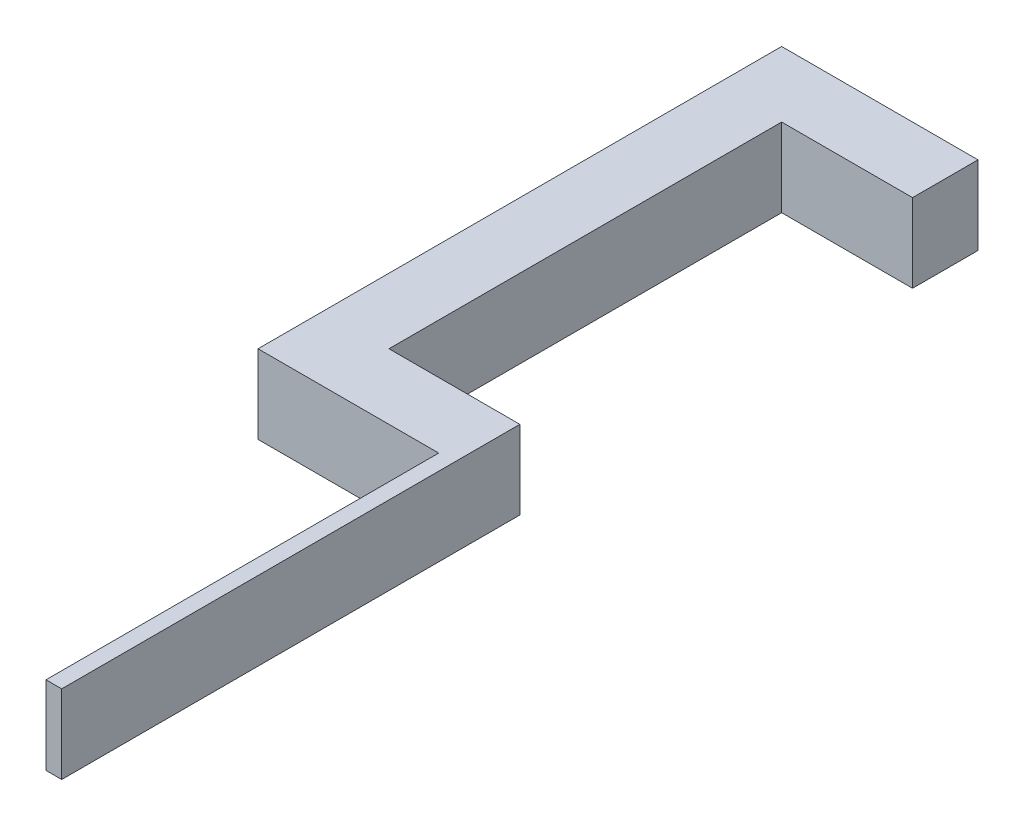
ISO-10303-21;
HEADER;
FILE_DESCRIPTION(('STEP AP214'),'2;1');
FILE_NAME('part.step','',(''),(''),'','','');
FILE_SCHEMA(('AUTOMOTIVE_DESIGN { 1 0 10303 214 1 1 1 1 }'));
ENDSEC;
DATA;
#1=APPLICATION_CONTEXT('core data for automotive mechanical design processes');
#2=APPLICATION_PROTOCOL_DEFINITION('international standard','automotive_design',2000,#1);
#3=PRODUCT_CONTEXT('',#1,'mechanical');
#4=PRODUCT('Part','Part','',(#3));
#5=PRODUCT_RELATED_PRODUCT_CATEGORY('part','',(#4));
#6=PRODUCT_DEFINITION_FORMATION('','',#4);
#7=PRODUCT_DEFINITION_CONTEXT('part definition',#1,'design');
#8=PRODUCT_DEFINITION('design','',#6,#7);
#9=PRODUCT_DEFINITION_SHAPE('','',#8);
#10=(LENGTH_UNIT() NAMED_UNIT(*) SI_UNIT(.MILLI.,.METRE.));
#11=(NAMED_UNIT(*) PLANE_ANGLE_UNIT() SI_UNIT($,.RADIAN.));
#12=(NAMED_UNIT(*) SI_UNIT($,.STERADIAN.) SOLID_ANGLE_UNIT());
#13=UNCERTAINTY_MEASURE_WITH_UNIT(LENGTH_MEASURE(1.E-05),#10,'distance_accuracy_value','');
#14=(GEOMETRIC_REPRESENTATION_CONTEXT(3) GLOBAL_UNCERTAINTY_ASSIGNED_CONTEXT((#13)) GLOBAL_UNIT_ASSIGNED_CONTEXT((#10,
#11,#12)) REPRESENTATION_CONTEXT('',''));
#15=CARTESIAN_POINT('',(0.,0.,0.));
#16=DIRECTION('',(0.,0.,1.));
#17=DIRECTION('',(1.,0.,0.));
#18=AXIS2_PLACEMENT_3D('',#15,#16,#17);
#19=CARTESIAN_POINT('',(-7.5,3.,0.));
#20=DIRECTION('',(1.,0.,0.));
#21=DIRECTION('',(0.,0.,-1.));
#22=AXIS2_PLACEMENT_3D('',#19,#20,#21);
#23=PLANE('',#22);
#24=DIRECTION('',(0.,0.,1.));
#25=VECTOR('',#24,1.);
#26=CARTESIAN_POINT('',(-7.5,0.,0.));
#27=LINE('',#26,#25);
#28=CARTESIAN_POINT('',(-7.50000000000001,0.,-20.));
#29=VERTEX_POINT('',#28);
#30=CARTESIAN_POINT('',(-7.5,0.,0.));
#31=VERTEX_POINT('',#30);
#32=EDGE_CURVE('E143',#29,#31,#27,.T.);
#33=ORIENTED_EDGE('',*,*,#32,.T.);
#34=DIRECTION('',(0.,-1.,0.));
#35=VECTOR('',#34,1.);
#36=CARTESIAN_POINT('',(-7.5,3.,0.));
#37=LINE('',#36,#35);
#38=CARTESIAN_POINT('',(-7.5,3.,0.));
#39=VERTEX_POINT('',#38);
#40=EDGE_CURVE('E11',#39,#31,#37,.T.);
#41=ORIENTED_EDGE('',*,*,#40,.F.);
#42=DIRECTION('',(0.,0.,1.));
#43=VECTOR('',#42,1.);
#44=CARTESIAN_POINT('',(-7.5,3.,0.));
#45=LINE('',#44,#43);
#46=CARTESIAN_POINT('',(-7.50000000000001,3.,-20.));
#47=VERTEX_POINT('',#46);
#48=EDGE_CURVE('E161',#47,#39,#45,.T.);
#49=ORIENTED_EDGE('',*,*,#48,.F.);
#50=DIRECTION('',(0.,-1.,0.));
#51=VECTOR('',#50,1.);
#52=CARTESIAN_POINT('',(-7.50000000000001,3.,-20.));
#53=LINE('',#52,#51);
#54=EDGE_CURVE('E139',#47,#29,#53,.T.);
#55=ORIENTED_EDGE('',*,*,#54,.T.);
#56=EDGE_LOOP('',(#33,#41,#49,#55));
#57=FACE_BOUND('',#56,.T.);
#58=ADVANCED_FACE('F35',(#57),#23,.F.);
#59=CARTESIAN_POINT('',(-0.599999999999997,3.,0.));
#60=DIRECTION('',(0.,0.,-1.));
#61=DIRECTION('',(-1.,0.,0.));
#62=AXIS2_PLACEMENT_3D('',#59,#60,#61);
#63=PLANE('',#62);
#64=DIRECTION('',(1.,0.,0.));
#65=VECTOR('',#64,1.);
#66=CARTESIAN_POINT('',(-0.599999999999997,0.,0.));
#67=LINE('',#66,#65);
#68=CARTESIAN_POINT('',(-0.599999999999997,0.,0.));
#69=VERTEX_POINT('',#68);
#70=EDGE_CURVE('E146',#31,#69,#67,.T.);
#71=ORIENTED_EDGE('',*,*,#70,.T.);
#72=DIRECTION('',(0.,-1.,0.));
#73=VECTOR('',#72,1.);
#74=CARTESIAN_POINT('',(-0.599999999999997,3.,0.));
#75=LINE('',#74,#73);
#76=CARTESIAN_POINT('',(-0.599999999999997,3.,0.));
#77=VERTEX_POINT('',#76);
#78=EDGE_CURVE('E43',#77,#69,#75,.T.);
#79=ORIENTED_EDGE('',*,*,#78,.F.);
#80=DIRECTION('',(1.,0.,0.));
#81=VECTOR('',#80,1.);
#82=CARTESIAN_POINT('',(-0.599999999999997,3.,0.));
#83=LINE('',#82,#81);
#84=EDGE_CURVE('E100',#39,#77,#83,.T.);
#85=ORIENTED_EDGE('',*,*,#84,.F.);
#86=ORIENTED_EDGE('',*,*,#40,.T.);
#87=EDGE_LOOP('',(#71,#79,#85,#86));
#88=FACE_BOUND('',#87,.T.);
#89=ADVANCED_FACE('F210',(#88),#63,.F.);
#90=CARTESIAN_POINT('',(-0.599999999999999,3.,15.));
#91=DIRECTION('',(1.,0.,0.));
#92=DIRECTION('',(0.,0.,-1.));
#93=AXIS2_PLACEMENT_3D('',#90,#91,#92);
#94=PLANE('',#93);
#95=DIRECTION('',(0.,0.,1.));
#96=VECTOR('',#95,1.);
#97=CARTESIAN_POINT('',(-0.599999999999999,0.,15.));
#98=LINE('',#97,#96);
#99=CARTESIAN_POINT('',(-0.599999999999999,0.,15.));
#100=VERTEX_POINT('',#99);
#101=EDGE_CURVE('E148',#69,#100,#98,.T.);
#102=ORIENTED_EDGE('',*,*,#101,.T.);
#103=DIRECTION('',(0.,-1.,0.));
#104=VECTOR('',#103,1.);
#105=CARTESIAN_POINT('',(-0.599999999999999,3.,15.));
#106=LINE('',#105,#104);
#107=CARTESIAN_POINT('',(-0.599999999999999,3.,15.));
#108=VERTEX_POINT('',#107);
#109=EDGE_CURVE('E174',#108,#100,#106,.T.);
#110=ORIENTED_EDGE('',*,*,#109,.F.);
#111=DIRECTION('',(0.,0.,1.));
#112=VECTOR('',#111,1.);
#113=CARTESIAN_POINT('',(-0.599999999999999,3.,15.));
#114=LINE('',#113,#112);
#115=EDGE_CURVE('E182',#77,#108,#114,.T.);
#116=ORIENTED_EDGE('',*,*,#115,.F.);
#117=ORIENTED_EDGE('',*,*,#78,.T.);
#118=EDGE_LOOP('',(#102,#110,#116,#117));
#119=FACE_BOUND('',#118,.T.);
#120=ADVANCED_FACE('F180',(#119),#94,.F.);
#121=CARTESIAN_POINT('',(0.,3.,15.));
#122=DIRECTION('',(0.,0.,-1.));
#123=DIRECTION('',(-1.,0.,0.));
#124=AXIS2_PLACEMENT_3D('',#121,#122,#123);
#125=PLANE('',#124);
#126=DIRECTION('',(1.,0.,0.));
#127=VECTOR('',#126,1.);
#128=CARTESIAN_POINT('',(0.,0.,15.));
#129=LINE('',#128,#127);
#130=CARTESIAN_POINT('',(0.,0.,15.));
#131=VERTEX_POINT('',#130);
#132=EDGE_CURVE('E150',#100,#131,#129,.T.);
#133=ORIENTED_EDGE('',*,*,#132,.T.);
#134=DIRECTION('',(0.,-1.,0.));
#135=VECTOR('',#134,1.);
#136=CARTESIAN_POINT('',(0.,3.,15.));
#137=LINE('',#136,#135);
#138=CARTESIAN_POINT('',(0.,3.,15.));
#139=VERTEX_POINT('',#138);
#140=EDGE_CURVE('E171',#139,#131,#137,.T.);
#141=ORIENTED_EDGE('',*,*,#140,.F.);
#142=DIRECTION('',(1.,0.,0.));
#143=VECTOR('',#142,1.);
#144=CARTESIAN_POINT('',(0.,3.,15.));
#145=LINE('',#144,#143);
#146=EDGE_CURVE('E200',#108,#139,#145,.T.);
#147=ORIENTED_EDGE('',*,*,#146,.F.);
#148=ORIENTED_EDGE('',*,*,#109,.T.);
#149=EDGE_LOOP('',(#133,#141,#147,#148));
#150=FACE_BOUND('',#149,.T.);
#151=ADVANCED_FACE('F191',(#150),#125,.F.);
#152=CARTESIAN_POINT('',(0.,3.,-2.5));
#153=DIRECTION('',(-1.,0.,0.));
#154=DIRECTION('',(0.,0.,1.));
#155=AXIS2_PLACEMENT_3D('',#152,#153,#154);
#156=PLANE('',#155);
#157=DIRECTION('',(0.,0.,-1.));
#158=VECTOR('',#157,1.);
#159=CARTESIAN_POINT('',(0.,0.,-2.5));
#160=LINE('',#159,#158);
#161=CARTESIAN_POINT('',(0.,0.,-2.5));
#162=VERTEX_POINT('',#161);
#163=EDGE_CURVE('E152',#131,#162,#160,.T.);
#164=ORIENTED_EDGE('',*,*,#163,.T.);
#165=DIRECTION('',(0.,-1.,0.));
#166=VECTOR('',#165,1.);
#167=CARTESIAN_POINT('',(0.,3.,-2.5));
#168=LINE('',#167,#166);
#169=CARTESIAN_POINT('',(0.,3.,-2.5));
#170=VERTEX_POINT('',#169);
#171=EDGE_CURVE('E168',#170,#162,#168,.T.);
#172=ORIENTED_EDGE('',*,*,#171,.F.);
#173=DIRECTION('',(0.,0.,-1.));
#174=VECTOR('',#173,1.);
#175=CARTESIAN_POINT('',(0.,3.,-2.5));
#176=LINE('',#175,#174);
#177=EDGE_CURVE('E197',#139,#170,#176,.T.);
#178=ORIENTED_EDGE('',*,*,#177,.F.);
#179=ORIENTED_EDGE('',*,*,#140,.T.);
#180=EDGE_LOOP('',(#164,#172,#178,#179));
#181=FACE_BOUND('',#180,.T.);
#182=ADVANCED_FACE('F195',(#181),#156,.F.);
#183=CARTESIAN_POINT('',(-5.,3.,-2.5));
#184=DIRECTION('',(0.,0.,1.));
#185=DIRECTION('',(1.,0.,0.));
#186=AXIS2_PLACEMENT_3D('',#183,#184,#185);
#187=PLANE('',#186);
#188=DIRECTION('',(-1.,0.,0.));
#189=VECTOR('',#188,1.);
#190=CARTESIAN_POINT('',(-5.,0.,-2.5));
#191=LINE('',#190,#189);
#192=CARTESIAN_POINT('',(-5.,0.,-2.5));
#193=VERTEX_POINT('',#192);
#194=EDGE_CURVE('E154',#162,#193,#191,.T.);
#195=ORIENTED_EDGE('',*,*,#194,.T.);
#196=DIRECTION('',(0.,-1.,0.));
#197=VECTOR('',#196,1.);
#198=CARTESIAN_POINT('',(-5.,3.,-2.5));
#199=LINE('',#198,#197);
#200=CARTESIAN_POINT('',(-5.,3.,-2.5));
#201=VERTEX_POINT('',#200);
#202=EDGE_CURVE('E165',#201,#193,#199,.T.);
#203=ORIENTED_EDGE('',*,*,#202,.F.);
#204=DIRECTION('',(-1.,0.,0.));
#205=VECTOR('',#204,1.);
#206=CARTESIAN_POINT('',(-5.,3.,-2.5));
#207=LINE('',#206,#205);
#208=EDGE_CURVE('E199',#170,#201,#207,.T.);
#209=ORIENTED_EDGE('',*,*,#208,.F.);
#210=ORIENTED_EDGE('',*,*,#171,.T.);
#211=EDGE_LOOP('',(#195,#203,#209,#210));
#212=FACE_BOUND('',#211,.T.);
#213=ADVANCED_FACE('F222',(#212),#187,.F.);
#214=CARTESIAN_POINT('',(-5.,3.,-17.5));
#215=DIRECTION('',(-1.,0.,0.));
#216=DIRECTION('',(0.,0.,1.));
#217=AXIS2_PLACEMENT_3D('',#214,#215,#216);
#218=PLANE('',#217);
#219=DIRECTION('',(0.,0.,-1.));
#220=VECTOR('',#219,1.);
#221=CARTESIAN_POINT('',(-5.,0.,-17.5));
#222=LINE('',#221,#220);
#223=CARTESIAN_POINT('',(-5.,0.,-17.5));
#224=VERTEX_POINT('',#223);
#225=EDGE_CURVE('E156',#193,#224,#222,.T.);
#226=ORIENTED_EDGE('',*,*,#225,.T.);
#227=DIRECTION('',(0.,-1.,0.));
#228=VECTOR('',#227,1.);
#229=CARTESIAN_POINT('',(-5.,3.,-17.5));
#230=LINE('',#229,#228);
#231=CARTESIAN_POINT('',(-5.,3.,-17.5));
#232=VERTEX_POINT('',#231);
#233=EDGE_CURVE('E134',#232,#224,#230,.T.);
#234=ORIENTED_EDGE('',*,*,#233,.F.);
#235=DIRECTION('',(0.,0.,-1.));
#236=VECTOR('',#235,1.);
#237=CARTESIAN_POINT('',(-5.,3.,-17.5));
#238=LINE('',#237,#236);
#239=EDGE_CURVE('E125',#201,#232,#238,.T.);
#240=ORIENTED_EDGE('',*,*,#239,.F.);
#241=ORIENTED_EDGE('',*,*,#202,.T.);
#242=EDGE_LOOP('',(#226,#234,#240,#241));
#243=FACE_BOUND('',#242,.T.);
#244=ADVANCED_FACE('F225',(#243),#218,.F.);
#245=CARTESIAN_POINT('',(0.,3.,-17.5));
#246=DIRECTION('',(0.,0.,-1.));
#247=DIRECTION('',(-1.,0.,0.));
#248=AXIS2_PLACEMENT_3D('',#245,#246,#247);
#249=PLANE('',#248);
#250=DIRECTION('',(1.,0.,0.));
#251=VECTOR('',#250,1.);
#252=CARTESIAN_POINT('',(0.,0.,-17.5));
#253=LINE('',#252,#251);
#254=CARTESIAN_POINT('',(0.,0.,-17.5));
#255=VERTEX_POINT('',#254);
#256=EDGE_CURVE('E133',#224,#255,#253,.T.);
#257=ORIENTED_EDGE('',*,*,#256,.T.);
#258=DIRECTION('',(0.,-1.,0.));
#259=VECTOR('',#258,1.);
#260=CARTESIAN_POINT('',(0.,3.,-17.5));
#261=LINE('',#260,#259);
#262=CARTESIAN_POINT('',(0.,3.,-17.5));
#263=VERTEX_POINT('',#262);
#264=EDGE_CURVE('E130',#263,#255,#261,.T.);
#265=ORIENTED_EDGE('',*,*,#264,.F.);
#266=DIRECTION('',(1.,0.,0.));
#267=VECTOR('',#266,1.);
#268=CARTESIAN_POINT('',(0.,3.,-17.5));
#269=LINE('',#268,#267);
#270=EDGE_CURVE('E119',#232,#263,#269,.T.);
#271=ORIENTED_EDGE('',*,*,#270,.F.);
#272=ORIENTED_EDGE('',*,*,#233,.T.);
#273=EDGE_LOOP('',(#257,#265,#271,#272));
#274=FACE_BOUND('',#273,.T.);
#275=ADVANCED_FACE('F131',(#274),#249,.F.);
#276=CARTESIAN_POINT('',(0.,3.,-20.));
#277=DIRECTION('',(-1.,0.,0.));
#278=DIRECTION('',(0.,0.,1.));
#279=AXIS2_PLACEMENT_3D('',#276,#277,#278);
#280=PLANE('',#279);
#281=DIRECTION('',(0.,0.,-1.));
#282=VECTOR('',#281,1.);
#283=CARTESIAN_POINT('',(0.,0.,-20.));
#284=LINE('',#283,#282);
#285=CARTESIAN_POINT('',(0.,0.,-20.));
#286=VERTEX_POINT('',#285);
#287=EDGE_CURVE('E86',#255,#286,#284,.T.);
#288=ORIENTED_EDGE('',*,*,#287,.T.);
#289=DIRECTION('',(0.,-1.,0.));
#290=VECTOR('',#289,1.);
#291=CARTESIAN_POINT('',(0.,3.,-20.));
#292=LINE('',#291,#290);
#293=CARTESIAN_POINT('',(0.,3.,-20.));
#294=VERTEX_POINT('',#293);
#295=EDGE_CURVE('E135',#294,#286,#292,.T.);
#296=ORIENTED_EDGE('',*,*,#295,.F.);
#297=DIRECTION('',(0.,0.,-1.));
#298=VECTOR('',#297,1.);
#299=CARTESIAN_POINT('',(0.,3.,-20.));
#300=LINE('',#299,#298);
#301=EDGE_CURVE('E123',#263,#294,#300,.T.);
#302=ORIENTED_EDGE('',*,*,#301,.F.);
#303=ORIENTED_EDGE('',*,*,#264,.T.);
#304=EDGE_LOOP('',(#288,#296,#302,#303));
#305=FACE_BOUND('',#304,.T.);
#306=ADVANCED_FACE('F137',(#305),#280,.F.);
#307=CARTESIAN_POINT('',(0.,3.,-20.));
#308=DIRECTION('',(0.,0.,1.));
#309=DIRECTION('',(1.,0.,0.));
#310=AXIS2_PLACEMENT_3D('',#307,#308,#309);
#311=PLANE('',#310);
#312=DIRECTION('',(-1.,0.,0.));
#313=VECTOR('',#312,1.);
#314=CARTESIAN_POINT('',(0.,0.,-20.));
#315=LINE('',#314,#313);
#316=EDGE_CURVE('E92',#286,#29,#315,.T.);
#317=ORIENTED_EDGE('',*,*,#316,.T.);
#318=ORIENTED_EDGE('',*,*,#54,.F.);
#319=DIRECTION('',(-1.,0.,0.));
#320=VECTOR('',#319,1.);
#321=CARTESIAN_POINT('',(0.,3.,-20.));
#322=LINE('',#321,#320);
#323=EDGE_CURVE('E51',#294,#47,#322,.T.);
#324=ORIENTED_EDGE('',*,*,#323,.F.);
#325=ORIENTED_EDGE('',*,*,#295,.T.);
#326=EDGE_LOOP('',(#317,#318,#324,#325));
#327=FACE_BOUND('',#326,.T.);
#328=ADVANCED_FACE('F234',(#327),#311,.F.);
#329=CARTESIAN_POINT('',(0.,3.,0.));
#330=DIRECTION('',(0.,1.,0.));
#331=DIRECTION('',(0.,0.,1.));
#332=AXIS2_PLACEMENT_3D('',#329,#330,#331);
#333=PLANE('',#332);
#334=ORIENTED_EDGE('',*,*,#48,.T.);
#335=ORIENTED_EDGE('',*,*,#84,.T.);
#336=ORIENTED_EDGE('',*,*,#115,.T.);
#337=ORIENTED_EDGE('',*,*,#146,.T.);
#338=ORIENTED_EDGE('',*,*,#177,.T.);
#339=ORIENTED_EDGE('',*,*,#208,.T.);
#340=ORIENTED_EDGE('',*,*,#239,.T.);
#341=ORIENTED_EDGE('',*,*,#270,.T.);
#342=ORIENTED_EDGE('',*,*,#301,.T.);
#343=ORIENTED_EDGE('',*,*,#323,.T.);
#344=EDGE_LOOP('',(#334,#335,#336,#337,#338,#339,#340,#341,#342,#343));
#345=FACE_BOUND('',#344,.T.);
#346=ADVANCED_FACE('F121',(#345),#333,.T.);
#347=CARTESIAN_POINT('',(0.,0.,0.));
#348=DIRECTION('',(0.,1.,0.));
#349=DIRECTION('',(0.,0.,1.));
#350=AXIS2_PLACEMENT_3D('',#347,#348,#349);
#351=PLANE('',#350);
#352=ORIENTED_EDGE('',*,*,#32,.F.);
#353=ORIENTED_EDGE('',*,*,#316,.F.);
#354=ORIENTED_EDGE('',*,*,#287,.F.);
#355=ORIENTED_EDGE('',*,*,#256,.F.);
#356=ORIENTED_EDGE('',*,*,#225,.F.);
#357=ORIENTED_EDGE('',*,*,#194,.F.);
#358=ORIENTED_EDGE('',*,*,#163,.F.);
#359=ORIENTED_EDGE('',*,*,#132,.F.);
#360=ORIENTED_EDGE('',*,*,#101,.F.);
#361=ORIENTED_EDGE('',*,*,#70,.F.);
#362=EDGE_LOOP('',(#352,#353,#354,#355,#356,#357,#358,#359,#360,#361));
#363=FACE_BOUND('',#362,.T.);
#364=ADVANCED_FACE('F186',(#363),#351,.F.);
#365=CLOSED_SHELL('',(#58,#89,#120,#151,#182,#213,#244,#275,#306,#328,#346,#364));
#366=MANIFOLD_SOLID_BREP('B2',#365);
#367=ADVANCED_BREP_SHAPE_REPRESENTATION('',(#18,#366),#14);
#368=SHAPE_DEFINITION_REPRESENTATION(#9,#367);
ENDSEC;
END-ISO-10303-21;
